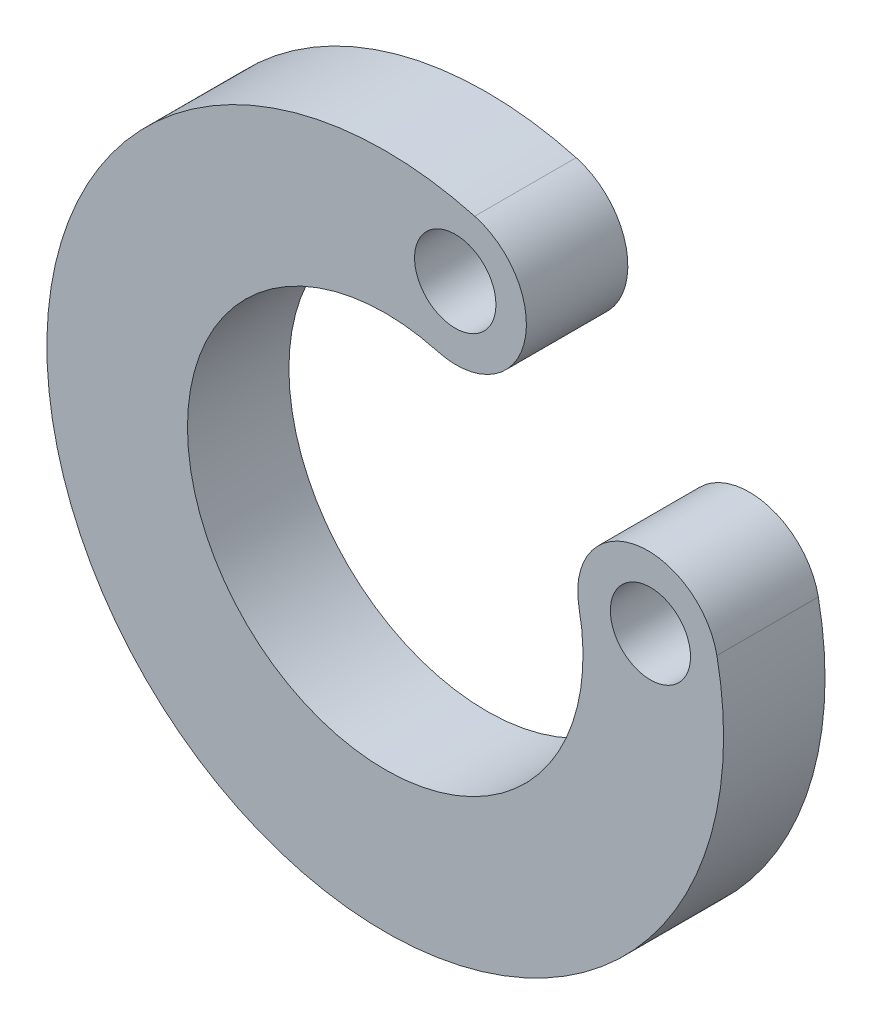
ISO-10303-21;
HEADER;
FILE_DESCRIPTION(('STEP AP214'),'2;1');
FILE_NAME('part.step','',(''),(''),'','','');
FILE_SCHEMA(('AUTOMOTIVE_DESIGN { 1 0 10303 214 1 1 1 1 }'));
ENDSEC;
DATA;
#1=APPLICATION_CONTEXT('core data for automotive mechanical design processes');
#2=APPLICATION_PROTOCOL_DEFINITION('international standard','automotive_design',2000,#1);
#3=PRODUCT_CONTEXT('',#1,'mechanical');
#4=PRODUCT('Part','Part','',(#3));
#5=PRODUCT_RELATED_PRODUCT_CATEGORY('part','',(#4));
#6=PRODUCT_DEFINITION_FORMATION('','',#4);
#7=PRODUCT_DEFINITION_CONTEXT('part definition',#1,'design');
#8=PRODUCT_DEFINITION('design','',#6,#7);
#9=PRODUCT_DEFINITION_SHAPE('','',#8);
#10=(LENGTH_UNIT() NAMED_UNIT(*) SI_UNIT(.MILLI.,.METRE.));
#11=(NAMED_UNIT(*) PLANE_ANGLE_UNIT() SI_UNIT($,.RADIAN.));
#12=(NAMED_UNIT(*) SI_UNIT($,.STERADIAN.) SOLID_ANGLE_UNIT());
#13=UNCERTAINTY_MEASURE_WITH_UNIT(LENGTH_MEASURE(1.E-05),#10,'distance_accuracy_value','');
#14=(GEOMETRIC_REPRESENTATION_CONTEXT(3) GLOBAL_UNCERTAINTY_ASSIGNED_CONTEXT((#13)) GLOBAL_UNIT_ASSIGNED_CONTEXT((#10,
#11,#12)) REPRESENTATION_CONTEXT('',''));
#15=CARTESIAN_POINT('',(0.,0.,0.));
#16=DIRECTION('',(0.,0.,1.));
#17=DIRECTION('',(1.,0.,0.));
#18=AXIS2_PLACEMENT_3D('',#15,#16,#17);
#19=CARTESIAN_POINT('',(-35.8211932594849,29.4604206246361,10.));
#20=DIRECTION('',(0.,0.,-1.));
#21=DIRECTION('',(-1.,0.,0.));
#22=AXIS2_PLACEMENT_3D('',#19,#20,#21);
#23=CYLINDRICAL_SURFACE('',#22,6.92901156126362);
#24=CARTESIAN_POINT('',(-35.8211932594849,29.4604206246361,0.));
#25=DIRECTION('',(0.,0.,1.));
#26=DIRECTION('',(1.,0.,0.));
#27=AXIS2_PLACEMENT_3D('',#24,#25,#26);
#28=CIRCLE('',#27,6.92901156126362);
#29=CARTESIAN_POINT('',(-37.6533460023018,22.7780245316831,0.));
#30=VERTEX_POINT('',#29);
#31=CARTESIAN_POINT('',(-33.9890405166679,36.1428167175891,0.));
#32=VERTEX_POINT('',#31);
#33=EDGE_CURVE('E110',#30,#32,#28,.T.);
#34=ORIENTED_EDGE('',*,*,#33,.T.);
#35=DIRECTION('',(0.,0.,-1.));
#36=VECTOR('',#35,1.);
#37=CARTESIAN_POINT('',(-33.9890405166679,36.1428167175891,10.));
#38=LINE('',#37,#36);
#39=CARTESIAN_POINT('',(-33.9890405166679,36.1428167175891,10.));
#40=VERTEX_POINT('',#39);
#41=EDGE_CURVE('E11',#40,#32,#38,.T.);
#42=ORIENTED_EDGE('',*,*,#41,.F.);
#43=CARTESIAN_POINT('',(-35.8211932594849,29.4604206246361,10.));
#44=DIRECTION('',(0.,0.,1.));
#45=DIRECTION('',(1.,0.,0.));
#46=AXIS2_PLACEMENT_3D('',#43,#44,#45);
#47=CIRCLE('',#46,6.92901156126362);
#48=CARTESIAN_POINT('',(-37.6533460023018,22.7780245316831,10.));
#49=VERTEX_POINT('',#48);
#50=EDGE_CURVE('E94',#49,#40,#47,.T.);
#51=ORIENTED_EDGE('',*,*,#50,.F.);
#52=DIRECTION('',(0.,0.,-1.));
#53=VECTOR('',#52,1.);
#54=CARTESIAN_POINT('',(-37.6533460023018,22.7780245316831,10.));
#55=LINE('',#54,#53);
#56=EDGE_CURVE('E106',#49,#30,#55,.T.);
#57=ORIENTED_EDGE('',*,*,#56,.T.);
#58=EDGE_LOOP('',(#34,#42,#51,#57));
#59=FACE_BOUND('',#58,.T.);
#60=ADVANCED_FACE('F42',(#59),#23,.T.);
#61=CARTESIAN_POINT('',(-42.8084208103513,3.97596128054523,10.));
#62=DIRECTION('',(0.,0.,-1.));
#63=DIRECTION('',(-1.,0.,0.));
#64=AXIS2_PLACEMENT_3D('',#61,#62,#63);
#65=CYLINDRICAL_SURFACE('',#64,33.353981133776);
#66=CARTESIAN_POINT('',(-42.8084208103513,3.97596128054523,0.));
#67=DIRECTION('',(0.,0.,1.));
#68=DIRECTION('',(1.,0.,0.));
#69=AXIS2_PLACEMENT_3D('',#66,#67,#68);
#70=CIRCLE('',#69,33.353981133776);
#71=CARTESIAN_POINT('',(-10.1143416899143,10.5778737261095,0.));
#72=VERTEX_POINT('',#71);
#73=EDGE_CURVE('E99',#32,#72,#70,.T.);
#74=ORIENTED_EDGE('',*,*,#73,.T.);
#75=DIRECTION('',(0.,0.,-1.));
#76=VECTOR('',#75,1.);
#77=CARTESIAN_POINT('',(-10.1143416899143,10.5778737261095,10.));
#78=LINE('',#77,#76);
#79=CARTESIAN_POINT('',(-10.1143416899143,10.5778737261095,10.));
#80=VERTEX_POINT('',#79);
#81=EDGE_CURVE('E51',#80,#72,#78,.T.);
#82=ORIENTED_EDGE('',*,*,#81,.F.);
#83=CARTESIAN_POINT('',(-42.8084208103513,3.97596128054523,10.));
#84=DIRECTION('',(0.,0.,1.));
#85=DIRECTION('',(1.,0.,0.));
#86=AXIS2_PLACEMENT_3D('',#83,#84,#85);
#87=CIRCLE('',#86,33.353981133776);
#88=EDGE_CURVE('E89',#40,#80,#87,.T.);
#89=ORIENTED_EDGE('',*,*,#88,.F.);
#90=ORIENTED_EDGE('',*,*,#41,.T.);
#91=EDGE_LOOP('',(#74,#82,#89,#90));
#92=FACE_BOUND('',#91,.T.);
#93=ADVANCED_FACE('F98',(#92),#65,.T.);
#94=CARTESIAN_POINT('',(-16.906264108464,9.20638144522426,10.));
#95=DIRECTION('',(0.,0.,-1.));
#96=DIRECTION('',(-1.,0.,0.));
#97=AXIS2_PLACEMENT_3D('',#94,#95,#96);
#98=CYLINDRICAL_SURFACE('',#97,6.92901156126361);
#99=CARTESIAN_POINT('',(-16.906264108464,9.20638144522426,0.));
#100=DIRECTION('',(0.,0.,1.));
#101=DIRECTION('',(1.,0.,0.));
#102=AXIS2_PLACEMENT_3D('',#99,#100,#101);
#103=CIRCLE('',#102,6.92901156126361);
#104=CARTESIAN_POINT('',(-23.6981865270136,7.83488916433905,0.));
#105=VERTEX_POINT('',#104);
#106=EDGE_CURVE('E76',#72,#105,#103,.T.);
#107=ORIENTED_EDGE('',*,*,#106,.T.);
#108=DIRECTION('',(0.,0.,-1.));
#109=VECTOR('',#108,1.);
#110=CARTESIAN_POINT('',(-23.6981865270136,7.83488916433905,10.));
#111=LINE('',#110,#109);
#112=CARTESIAN_POINT('',(-23.6981865270136,7.83488916433905,10.));
#113=VERTEX_POINT('',#112);
#114=EDGE_CURVE('E101',#113,#105,#111,.T.);
#115=ORIENTED_EDGE('',*,*,#114,.F.);
#116=CARTESIAN_POINT('',(-16.906264108464,9.20638144522426,10.));
#117=DIRECTION('',(0.,0.,1.));
#118=DIRECTION('',(1.,0.,0.));
#119=AXIS2_PLACEMENT_3D('',#116,#117,#118);
#120=CIRCLE('',#119,6.92901156126361);
#121=EDGE_CURVE('E92',#80,#113,#120,.T.);
#122=ORIENTED_EDGE('',*,*,#121,.F.);
#123=ORIENTED_EDGE('',*,*,#81,.T.);
#124=EDGE_LOOP('',(#107,#115,#122,#123));
#125=FACE_BOUND('',#124,.T.);
#126=ADVANCED_FACE('F102',(#125),#98,.T.);
#127=CARTESIAN_POINT('',(-42.8084208103513,3.97596128054523,10.));
#128=DIRECTION('',(0.,0.,-1.));
#129=DIRECTION('',(-1.,0.,0.));
#130=AXIS2_PLACEMENT_3D('',#127,#128,#129);
#131=CYLINDRICAL_SURFACE('',#130,19.4959580112488);
#132=CARTESIAN_POINT('',(-42.8084208103513,3.97596128054523,0.));
#133=DIRECTION('',(0.,0.,-1.));
#134=DIRECTION('',(1.,0.,0.));
#135=AXIS2_PLACEMENT_3D('',#132,#133,#134);
#136=CIRCLE('',#135,19.4959580112488);
#137=EDGE_CURVE('E82',#105,#30,#136,.T.);
#138=ORIENTED_EDGE('',*,*,#137,.T.);
#139=ORIENTED_EDGE('',*,*,#56,.F.);
#140=CARTESIAN_POINT('',(-42.8084208103513,3.97596128054523,10.));
#141=DIRECTION('',(0.,0.,-1.));
#142=DIRECTION('',(1.,0.,0.));
#143=AXIS2_PLACEMENT_3D('',#140,#141,#142);
#144=CIRCLE('',#143,19.4959580112488);
#145=EDGE_CURVE('E59',#113,#49,#144,.T.);
#146=ORIENTED_EDGE('',*,*,#145,.F.);
#147=ORIENTED_EDGE('',*,*,#114,.T.);
#148=EDGE_LOOP('',(#138,#139,#146,#147));
#149=FACE_BOUND('',#148,.T.);
#150=ADVANCED_FACE('F124',(#149),#131,.F.);
#151=CARTESIAN_POINT('',(-39.3148070349181,16.7181909525907,10.));
#152=DIRECTION('',(0.,0.,1.));
#153=DIRECTION('',(1.,0.,0.));
#154=AXIS2_PLACEMENT_3D('',#151,#152,#153);
#155=PLANE('',#154);
#156=CARTESIAN_POINT('',(-16.6650021005664,9.17216872596835,10.));
#157=DIRECTION('',(0.,0.,1.));
#158=DIRECTION('',(1.,0.,0.));
#159=AXIS2_PLACEMENT_3D('',#156,#157,#158);
#160=CIRCLE('',#159,3.95091199358452);
#161=CARTESIAN_POINT('',(-12.7140901069819,9.17216872596835,10.));
#162=VERTEX_POINT('',#161);
#163=EDGE_CURVE('E139',#162,#162,#160,.T.);
#164=ORIENTED_EDGE('',*,*,#163,.F.);
#165=EDGE_LOOP('',(#164));
#166=FACE_BOUND('',#165,.T.);
#167=CARTESIAN_POINT('',(-35.9072077968988,29.6322355423217,10.));
#168=DIRECTION('',(0.,0.,1.));
#169=DIRECTION('',(1.,0.,0.));
#170=AXIS2_PLACEMENT_3D('',#167,#168,#169);
#171=CIRCLE('',#170,4.01052677431541);
#172=CARTESIAN_POINT('',(-31.8966810225834,29.6322355423217,10.));
#173=VERTEX_POINT('',#172);
#174=EDGE_CURVE('E135',#173,#173,#171,.T.);
#175=ORIENTED_EDGE('',*,*,#174,.F.);
#176=EDGE_LOOP('',(#175));
#177=FACE_BOUND('',#176,.T.);
#178=ORIENTED_EDGE('',*,*,#50,.T.);
#179=ORIENTED_EDGE('',*,*,#88,.T.);
#180=ORIENTED_EDGE('',*,*,#121,.T.);
#181=ORIENTED_EDGE('',*,*,#145,.T.);
#182=EDGE_LOOP('',(#178,#179,#180,#181));
#183=FACE_BOUND('',#182,.T.);
#184=ADVANCED_FACE('F90',(#166,#177,#183),#155,.T.);
#185=CARTESIAN_POINT('',(-39.3148070349181,16.7181909525907,0.));
#186=DIRECTION('',(0.,0.,1.));
#187=DIRECTION('',(1.,0.,0.));
#188=AXIS2_PLACEMENT_3D('',#185,#186,#187);
#189=PLANE('',#188);
#190=CARTESIAN_POINT('',(-16.6650021005664,9.17216872596835,0.));
#191=DIRECTION('',(0.,0.,1.));
#192=DIRECTION('',(1.,0.,0.));
#193=AXIS2_PLACEMENT_3D('',#190,#191,#192);
#194=CIRCLE('',#193,3.95091199358452);
#195=CARTESIAN_POINT('',(-12.7140901069819,9.17216872596835,0.));
#196=VERTEX_POINT('',#195);
#197=EDGE_CURVE('E114',#196,#196,#194,.T.);
#198=ORIENTED_EDGE('',*,*,#197,.T.);
#199=EDGE_LOOP('',(#198));
#200=FACE_BOUND('',#199,.T.);
#201=CARTESIAN_POINT('',(-35.9072077968988,29.6322355423217,0.));
#202=DIRECTION('',(0.,0.,1.));
#203=DIRECTION('',(1.,0.,0.));
#204=AXIS2_PLACEMENT_3D('',#201,#202,#203);
#205=CIRCLE('',#204,4.01052677431541);
#206=CARTESIAN_POINT('',(-31.8966810225834,29.6322355423217,0.));
#207=VERTEX_POINT('',#206);
#208=EDGE_CURVE('E131',#207,#207,#205,.T.);
#209=ORIENTED_EDGE('',*,*,#208,.T.);
#210=EDGE_LOOP('',(#209));
#211=FACE_BOUND('',#210,.T.);
#212=ORIENTED_EDGE('',*,*,#33,.F.);
#213=ORIENTED_EDGE('',*,*,#137,.F.);
#214=ORIENTED_EDGE('',*,*,#106,.F.);
#215=ORIENTED_EDGE('',*,*,#73,.F.);
#216=EDGE_LOOP('',(#212,#213,#214,#215));
#217=FACE_BOUND('',#216,.T.);
#218=ADVANCED_FACE('F127',(#200,#211,#217),#189,.F.);
#219=CARTESIAN_POINT('',(-35.9072077968988,29.6322355423217,0.));
#220=DIRECTION('',(0.,0.,1.));
#221=DIRECTION('',(1.,0.,0.));
#222=AXIS2_PLACEMENT_3D('',#219,#220,#221);
#223=CYLINDRICAL_SURFACE('',#222,4.01052677431541);
#224=ORIENTED_EDGE('',*,*,#208,.F.);
#225=EDGE_LOOP('',(#224));
#226=FACE_BOUND('',#225,.T.);
#227=ORIENTED_EDGE('',*,*,#174,.T.);
#228=EDGE_LOOP('',(#227));
#229=FACE_BOUND('',#228,.T.);
#230=ADVANCED_FACE('F152',(#226,#229),#223,.F.);
#231=CARTESIAN_POINT('',(-16.6650021005664,9.17216872596835,0.));
#232=DIRECTION('',(0.,0.,1.));
#233=DIRECTION('',(1.,0.,0.));
#234=AXIS2_PLACEMENT_3D('',#231,#232,#233);
#235=CYLINDRICAL_SURFACE('',#234,3.95091199358452);
#236=ORIENTED_EDGE('',*,*,#197,.F.);
#237=EDGE_LOOP('',(#236));
#238=FACE_BOUND('',#237,.T.);
#239=ORIENTED_EDGE('',*,*,#163,.T.);
#240=EDGE_LOOP('',(#239));
#241=FACE_BOUND('',#240,.T.);
#242=ADVANCED_FACE('F149',(#238,#241),#235,.F.);
#243=CLOSED_SHELL('',(#60,#93,#126,#150,#184,#218,#230,#242));
#244=MANIFOLD_SOLID_BREP('B2',#243);
#245=ADVANCED_BREP_SHAPE_REPRESENTATION('',(#18,#244),#14);
#246=SHAPE_DEFINITION_REPRESENTATION(#9,#245);
ENDSEC;
END-ISO-10303-21;
